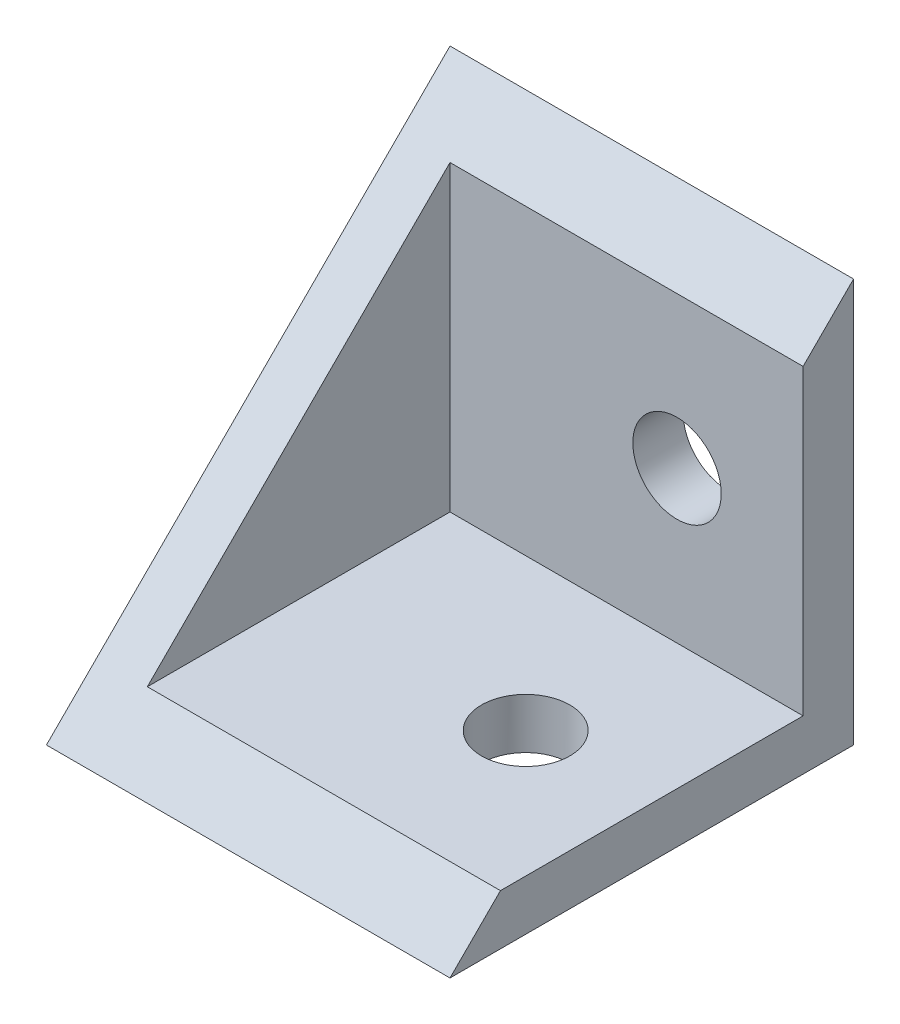
ISO-10303-21;
HEADER;
FILE_DESCRIPTION(('STEP AP214'),'2;1');
FILE_NAME('part.step','',(''),(''),'','','');
FILE_SCHEMA(('AUTOMOTIVE_DESIGN { 1 0 10303 214 1 1 1 1 }'));
ENDSEC;
DATA;
#1=APPLICATION_CONTEXT('core data for automotive mechanical design processes');
#2=APPLICATION_PROTOCOL_DEFINITION('international standard','automotive_design',2000,#1);
#3=PRODUCT_CONTEXT('',#1,'mechanical');
#4=PRODUCT('Part','Part','',(#3));
#5=PRODUCT_RELATED_PRODUCT_CATEGORY('part','',(#4));
#6=PRODUCT_DEFINITION_FORMATION('','',#4);
#7=PRODUCT_DEFINITION_CONTEXT('part definition',#1,'design');
#8=PRODUCT_DEFINITION('design','',#6,#7);
#9=PRODUCT_DEFINITION_SHAPE('','',#8);
#10=(LENGTH_UNIT() NAMED_UNIT(*) SI_UNIT(.MILLI.,.METRE.));
#11=(NAMED_UNIT(*) PLANE_ANGLE_UNIT() SI_UNIT($,.RADIAN.));
#12=(NAMED_UNIT(*) SI_UNIT($,.STERADIAN.) SOLID_ANGLE_UNIT());
#13=UNCERTAINTY_MEASURE_WITH_UNIT(LENGTH_MEASURE(1.E-05),#10,'distance_accuracy_value','');
#14=(GEOMETRIC_REPRESENTATION_CONTEXT(3) GLOBAL_UNCERTAINTY_ASSIGNED_CONTEXT((#13)) GLOBAL_UNIT_ASSIGNED_CONTEXT((#10,
#11,#12)) REPRESENTATION_CONTEXT('',''));
#15=CARTESIAN_POINT('',(0.,0.,0.));
#16=DIRECTION('',(0.,0.,1.));
#17=DIRECTION('',(1.,0.,0.));
#18=AXIS2_PLACEMENT_3D('',#15,#16,#17);
#19=CARTESIAN_POINT('',(-12.7,25.4,-12.7));
#20=DIRECTION('',(0.,-0.707106781186548,-0.707106781186548));
#21=DIRECTION('',(0.,0.707106781186548,-0.707106781186548));
#22=AXIS2_PLACEMENT_3D('',#19,#20,#21);
#23=PLANE('',#22);
#24=DIRECTION('',(-1.,0.,0.));
#25=VECTOR('',#24,1.);
#26=CARTESIAN_POINT('',(67.6926131403119,22.225,-9.525));
#27=LINE('',#26,#25);
#28=CARTESIAN_POINT('',(12.7,22.225,-9.525));
#29=VERTEX_POINT('',#28);
#30=CARTESIAN_POINT('',(-9.525,22.225,-9.52500000000001));
#31=VERTEX_POINT('',#30);
#32=EDGE_CURVE('E58',#29,#31,#27,.T.);
#33=ORIENTED_EDGE('',*,*,#32,.F.);
#34=DIRECTION('',(0.,0.707106781186547,-0.707106781186547));
#35=VECTOR('',#34,1.);
#36=CARTESIAN_POINT('',(12.7,25.4,-12.7));
#37=LINE('',#36,#35);
#38=CARTESIAN_POINT('',(12.7,25.4,-12.7));
#39=VERTEX_POINT('',#38);
#40=EDGE_CURVE('E115',#29,#39,#37,.T.);
#41=ORIENTED_EDGE('',*,*,#40,.T.);
#42=DIRECTION('',(-1.,0.,0.));
#43=VECTOR('',#42,1.);
#44=CARTESIAN_POINT('',(-12.7,25.4,-12.7));
#45=LINE('',#44,#43);
#46=CARTESIAN_POINT('',(-12.7,25.4,-12.7));
#47=VERTEX_POINT('',#46);
#48=EDGE_CURVE('E139',#39,#47,#45,.T.);
#49=ORIENTED_EDGE('',*,*,#48,.T.);
#50=DIRECTION('',(0.,0.707106781186547,-0.707106781186547));
#51=VECTOR('',#50,1.);
#52=CARTESIAN_POINT('',(-12.7,25.4,-12.7));
#53=LINE('',#52,#51);
#54=CARTESIAN_POINT('',(-12.7,0.,12.7));
#55=VERTEX_POINT('',#54);
#56=EDGE_CURVE('E66',#55,#47,#53,.T.);
#57=ORIENTED_EDGE('',*,*,#56,.F.);
#58=DIRECTION('',(1.,0.,0.));
#59=VECTOR('',#58,1.);
#60=CARTESIAN_POINT('',(-12.7,0.,12.7));
#61=LINE('',#60,#59);
#62=CARTESIAN_POINT('',(12.7,0.,12.7));
#63=VERTEX_POINT('',#62);
#64=EDGE_CURVE('E142',#55,#63,#61,.T.);
#65=ORIENTED_EDGE('',*,*,#64,.T.);
#66=CARTESIAN_POINT('',(12.7,3.175,9.525));
#67=VERTEX_POINT('',#66);
#68=EDGE_CURVE('E136',#63,#67,#37,.T.);
#69=ORIENTED_EDGE('',*,*,#68,.T.);
#70=DIRECTION('',(-1.,0.,0.));
#71=VECTOR('',#70,1.);
#72=CARTESIAN_POINT('',(67.6926131403119,3.175,9.525));
#73=LINE('',#72,#71);
#74=CARTESIAN_POINT('',(-9.52499999999999,3.175,9.525));
#75=VERTEX_POINT('',#74);
#76=EDGE_CURVE('E103',#67,#75,#73,.T.);
#77=ORIENTED_EDGE('',*,*,#76,.T.);
#78=DIRECTION('',(0.,0.707106781186547,-0.707106781186547));
#79=VECTOR('',#78,1.);
#80=CARTESIAN_POINT('',(-9.525,25.4,-12.7));
#81=LINE('',#80,#79);
#82=EDGE_CURVE('E120',#75,#31,#81,.T.);
#83=ORIENTED_EDGE('',*,*,#82,.T.);
#84=EDGE_LOOP('',(#33,#41,#49,#57,#65,#69,#77,#83));
#85=FACE_BOUND('',#84,.T.);
#86=ADVANCED_FACE('F42',(#85),#23,.F.);
#87=CARTESIAN_POINT('',(12.7,25.4,12.7));
#88=DIRECTION('',(-1.,0.,0.));
#89=DIRECTION('',(0.,0.,1.));
#90=AXIS2_PLACEMENT_3D('',#87,#88,#89);
#91=PLANE('',#90);
#92=ORIENTED_EDGE('',*,*,#40,.F.);
#93=DIRECTION('',(0.,-1.,0.));
#94=VECTOR('',#93,1.);
#95=CARTESIAN_POINT('',(12.7,3.175,-9.525));
#96=LINE('',#95,#94);
#97=CARTESIAN_POINT('',(12.7,3.175,-9.525));
#98=VERTEX_POINT('',#97);
#99=EDGE_CURVE('E110',#29,#98,#96,.T.);
#100=ORIENTED_EDGE('',*,*,#99,.T.);
#101=DIRECTION('',(0.,0.,1.));
#102=VECTOR('',#101,1.);
#103=CARTESIAN_POINT('',(12.7,3.175,9.525));
#104=LINE('',#103,#102);
#105=EDGE_CURVE('E97',#98,#67,#104,.T.);
#106=ORIENTED_EDGE('',*,*,#105,.T.);
#107=ORIENTED_EDGE('',*,*,#68,.F.);
#108=DIRECTION('',(0.,0.,-1.));
#109=VECTOR('',#108,1.);
#110=CARTESIAN_POINT('',(12.7,0.,12.7));
#111=LINE('',#110,#109);
#112=CARTESIAN_POINT('',(12.7,0.,-12.7));
#113=VERTEX_POINT('',#112);
#114=EDGE_CURVE('E135',#63,#113,#111,.T.);
#115=ORIENTED_EDGE('',*,*,#114,.T.);
#116=DIRECTION('',(0.,-1.,0.));
#117=VECTOR('',#116,1.);
#118=CARTESIAN_POINT('',(12.7,25.4,-12.7));
#119=LINE('',#118,#117);
#120=EDGE_CURVE('E11',#39,#113,#119,.T.);
#121=ORIENTED_EDGE('',*,*,#120,.F.);
#122=EDGE_LOOP('',(#92,#100,#106,#107,#115,#121));
#123=FACE_BOUND('',#122,.T.);
#124=ADVANCED_FACE('F44',(#123),#91,.F.);
#125=CARTESIAN_POINT('',(-12.7,25.4,-12.7));
#126=DIRECTION('',(0.,0.,1.));
#127=DIRECTION('',(1.,0.,0.));
#128=AXIS2_PLACEMENT_3D('',#125,#126,#127);
#129=PLANE('',#128);
#130=CARTESIAN_POINT('',(4.7625,12.7,-12.7));
#131=DIRECTION('',(0.,0.,1.));
#132=DIRECTION('',(1.,0.,0.));
#133=AXIS2_PLACEMENT_3D('',#130,#131,#132);
#134=CIRCLE('',#133,2.7813);
#135=CARTESIAN_POINT('',(7.5438,12.7,-12.7));
#136=VERTEX_POINT('',#135);
#137=EDGE_CURVE('E124',#136,#136,#134,.T.);
#138=ORIENTED_EDGE('',*,*,#137,.T.);
#139=EDGE_LOOP('',(#138));
#140=FACE_BOUND('',#139,.T.);
#141=DIRECTION('',(-1.,0.,0.));
#142=VECTOR('',#141,1.);
#143=CARTESIAN_POINT('',(-12.7,0.,-12.7));
#144=LINE('',#143,#142);
#145=CARTESIAN_POINT('',(-12.7,0.,-12.7));
#146=VERTEX_POINT('',#145);
#147=EDGE_CURVE('E146',#113,#146,#144,.T.);
#148=ORIENTED_EDGE('',*,*,#147,.T.);
#149=DIRECTION('',(0.,-1.,0.));
#150=VECTOR('',#149,1.);
#151=CARTESIAN_POINT('',(-12.7,25.4,-12.7));
#152=LINE('',#151,#150);
#153=EDGE_CURVE('E51',#47,#146,#152,.T.);
#154=ORIENTED_EDGE('',*,*,#153,.F.);
#155=ORIENTED_EDGE('',*,*,#48,.F.);
#156=ORIENTED_EDGE('',*,*,#120,.T.);
#157=EDGE_LOOP('',(#148,#154,#155,#156));
#158=FACE_BOUND('',#157,.T.);
#159=ADVANCED_FACE('F165',(#140,#158),#129,.F.);
#160=CARTESIAN_POINT('',(-12.7,25.4,12.7));
#161=DIRECTION('',(1.,0.,0.));
#162=DIRECTION('',(0.,0.,-1.));
#163=AXIS2_PLACEMENT_3D('',#160,#161,#162);
#164=PLANE('',#163);
#165=DIRECTION('',(0.,0.,1.));
#166=VECTOR('',#165,1.);
#167=CARTESIAN_POINT('',(-12.7,0.,12.7));
#168=LINE('',#167,#166);
#169=EDGE_CURVE('E149',#146,#55,#168,.T.);
#170=ORIENTED_EDGE('',*,*,#169,.T.);
#171=ORIENTED_EDGE('',*,*,#56,.T.);
#172=ORIENTED_EDGE('',*,*,#153,.T.);
#173=EDGE_LOOP('',(#170,#171,#172));
#174=FACE_BOUND('',#173,.T.);
#175=ADVANCED_FACE('F158',(#174),#164,.F.);
#176=CARTESIAN_POINT('',(0.,0.,0.));
#177=DIRECTION('',(0.,-1.,0.));
#178=DIRECTION('',(0.,0.,-1.));
#179=AXIS2_PLACEMENT_3D('',#176,#177,#178);
#180=PLANE('',#179);
#181=CARTESIAN_POINT('',(4.7625,0.,0.));
#182=DIRECTION('',(0.,-1.,0.));
#183=DIRECTION('',(0.,0.,-1.));
#184=AXIS2_PLACEMENT_3D('',#181,#182,#183);
#185=CIRCLE('',#184,2.7813);
#186=CARTESIAN_POINT('',(4.7625,0.,-2.7813));
#187=VERTEX_POINT('',#186);
#188=EDGE_CURVE('E208',#187,#187,#185,.T.);
#189=ORIENTED_EDGE('',*,*,#188,.F.);
#190=EDGE_LOOP('',(#189));
#191=FACE_BOUND('',#190,.T.);
#192=ORIENTED_EDGE('',*,*,#114,.F.);
#193=ORIENTED_EDGE('',*,*,#64,.F.);
#194=ORIENTED_EDGE('',*,*,#169,.F.);
#195=ORIENTED_EDGE('',*,*,#147,.F.);
#196=EDGE_LOOP('',(#192,#193,#194,#195));
#197=FACE_BOUND('',#196,.T.);
#198=ADVANCED_FACE('F164',(#191,#197),#180,.T.);
#199=CARTESIAN_POINT('',(67.6926131403119,3.175,-9.525));
#200=DIRECTION('',(0.,0.,1.));
#201=DIRECTION('',(0.,-1.,0.));
#202=AXIS2_PLACEMENT_3D('',#199,#200,#201);
#203=PLANE('',#202);
#204=CARTESIAN_POINT('',(4.7625,12.7,-9.525));
#205=DIRECTION('',(0.,0.,1.));
#206=DIRECTION('',(1.,0.,0.));
#207=AXIS2_PLACEMENT_3D('',#204,#205,#206);
#208=CIRCLE('',#207,2.7813);
#209=CARTESIAN_POINT('',(7.5438,12.7,-9.525));
#210=VERTEX_POINT('',#209);
#211=EDGE_CURVE('E204',#210,#210,#208,.T.);
#212=ORIENTED_EDGE('',*,*,#211,.F.);
#213=EDGE_LOOP('',(#212));
#214=FACE_BOUND('',#213,.T.);
#215=ORIENTED_EDGE('',*,*,#99,.F.);
#216=ORIENTED_EDGE('',*,*,#32,.T.);
#217=DIRECTION('',(0.,-1.,0.));
#218=VECTOR('',#217,1.);
#219=CARTESIAN_POINT('',(-9.52499999999999,3.175,-9.525));
#220=LINE('',#219,#218);
#221=CARTESIAN_POINT('',(-9.52499999999999,3.175,-9.525));
#222=VERTEX_POINT('',#221);
#223=EDGE_CURVE('E113',#31,#222,#220,.T.);
#224=ORIENTED_EDGE('',*,*,#223,.T.);
#225=DIRECTION('',(-1.,0.,0.));
#226=VECTOR('',#225,1.);
#227=CARTESIAN_POINT('',(67.6926131403119,3.175,-9.525));
#228=LINE('',#227,#226);
#229=EDGE_CURVE('E101',#98,#222,#228,.T.);
#230=ORIENTED_EDGE('',*,*,#229,.F.);
#231=EDGE_LOOP('',(#215,#216,#224,#230));
#232=FACE_BOUND('',#231,.T.);
#233=ADVANCED_FACE('F112',(#214,#232),#203,.T.);
#234=CARTESIAN_POINT('',(67.6926131403119,3.175,9.525));
#235=DIRECTION('',(0.,1.,0.));
#236=DIRECTION('',(0.,0.,1.));
#237=AXIS2_PLACEMENT_3D('',#234,#235,#236);
#238=PLANE('',#237);
#239=CARTESIAN_POINT('',(4.7625,3.175,0.));
#240=DIRECTION('',(0.,1.,0.));
#241=DIRECTION('',(0.,0.,1.));
#242=AXIS2_PLACEMENT_3D('',#239,#240,#241);
#243=CIRCLE('',#242,2.7813);
#244=CARTESIAN_POINT('',(4.7625,3.175,2.7813));
#245=VERTEX_POINT('',#244);
#246=EDGE_CURVE('E214',#245,#245,#243,.T.);
#247=ORIENTED_EDGE('',*,*,#246,.F.);
#248=EDGE_LOOP('',(#247));
#249=FACE_BOUND('',#248,.T.);
#250=ORIENTED_EDGE('',*,*,#105,.F.);
#251=ORIENTED_EDGE('',*,*,#229,.T.);
#252=DIRECTION('',(0.,0.,1.));
#253=VECTOR('',#252,1.);
#254=CARTESIAN_POINT('',(-9.52499999999999,3.175,9.525));
#255=LINE('',#254,#253);
#256=EDGE_CURVE('E109',#222,#75,#255,.T.);
#257=ORIENTED_EDGE('',*,*,#256,.T.);
#258=ORIENTED_EDGE('',*,*,#76,.F.);
#259=EDGE_LOOP('',(#250,#251,#257,#258));
#260=FACE_BOUND('',#259,.T.);
#261=ADVANCED_FACE('F99',(#249,#260),#238,.T.);
#262=CARTESIAN_POINT('',(-9.525,25.4,12.7));
#263=DIRECTION('',(-1.,0.,0.));
#264=DIRECTION('',(0.,0.,1.));
#265=AXIS2_PLACEMENT_3D('',#262,#263,#264);
#266=PLANE('',#265);
#267=ORIENTED_EDGE('',*,*,#82,.F.);
#268=ORIENTED_EDGE('',*,*,#256,.F.);
#269=ORIENTED_EDGE('',*,*,#223,.F.);
#270=EDGE_LOOP('',(#267,#268,#269));
#271=FACE_BOUND('',#270,.T.);
#272=ADVANCED_FACE('F170',(#271),#266,.F.);
#273=CARTESIAN_POINT('',(4.7625,12.7,-31.75));
#274=DIRECTION('',(0.,0.,1.));
#275=DIRECTION('',(1.,0.,0.));
#276=AXIS2_PLACEMENT_3D('',#273,#274,#275);
#277=CYLINDRICAL_SURFACE('',#276,2.7813);
#278=ORIENTED_EDGE('',*,*,#211,.T.);
#279=EDGE_LOOP('',(#278));
#280=FACE_BOUND('',#279,.T.);
#281=ORIENTED_EDGE('',*,*,#137,.F.);
#282=EDGE_LOOP('',(#281));
#283=FACE_BOUND('',#282,.T.);
#284=ADVANCED_FACE('F172',(#280,#283),#277,.F.);
#285=CARTESIAN_POINT('',(4.7625,-19.05,0.));
#286=DIRECTION('',(0.,1.,0.));
#287=DIRECTION('',(0.,0.,1.));
#288=AXIS2_PLACEMENT_3D('',#285,#286,#287);
#289=CYLINDRICAL_SURFACE('',#288,2.7813);
#290=ORIENTED_EDGE('',*,*,#188,.T.);
#291=EDGE_LOOP('',(#290));
#292=FACE_BOUND('',#291,.T.);
#293=ORIENTED_EDGE('',*,*,#246,.T.);
#294=EDGE_LOOP('',(#293));
#295=FACE_BOUND('',#294,.T.);
#296=ADVANCED_FACE('F178',(#292,#295),#289,.F.);
#297=CLOSED_SHELL('',(#86,#124,#159,#175,#198,#233,#261,#272,#284,#296));
#298=MANIFOLD_SOLID_BREP('B2',#297);
#299=ADVANCED_BREP_SHAPE_REPRESENTATION('',(#18,#298),#14);
#300=SHAPE_DEFINITION_REPRESENTATION(#9,#299);
ENDSEC;
END-ISO-10303-21;
